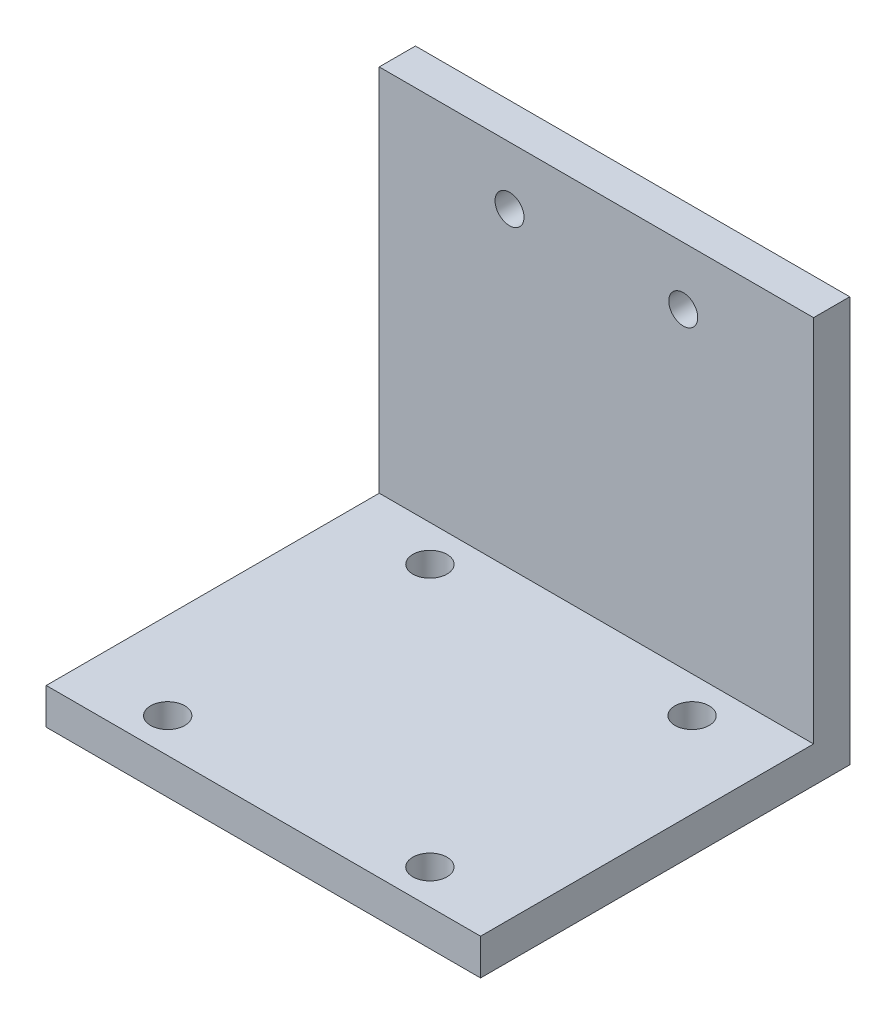
ISO-10303-21;
HEADER;
FILE_DESCRIPTION(('STEP AP214'),'2;1');
FILE_NAME('part.step','',(''),(''),'','','');
FILE_SCHEMA(('AUTOMOTIVE_DESIGN { 1 0 10303 214 1 1 1 1 }'));
ENDSEC;
DATA;
#1=APPLICATION_CONTEXT('core data for automotive mechanical design processes');
#2=APPLICATION_PROTOCOL_DEFINITION('international standard','automotive_design',2000,#1);
#3=PRODUCT_CONTEXT('',#1,'mechanical');
#4=PRODUCT('Part','Part','',(#3));
#5=PRODUCT_RELATED_PRODUCT_CATEGORY('part','',(#4));
#6=PRODUCT_DEFINITION_FORMATION('','',#4);
#7=PRODUCT_DEFINITION_CONTEXT('part definition',#1,'design');
#8=PRODUCT_DEFINITION('design','',#6,#7);
#9=PRODUCT_DEFINITION_SHAPE('','',#8);
#10=(LENGTH_UNIT() NAMED_UNIT(*) SI_UNIT(.MILLI.,.METRE.));
#11=(NAMED_UNIT(*) PLANE_ANGLE_UNIT() SI_UNIT($,.RADIAN.));
#12=(NAMED_UNIT(*) SI_UNIT($,.STERADIAN.) SOLID_ANGLE_UNIT());
#13=UNCERTAINTY_MEASURE_WITH_UNIT(LENGTH_MEASURE(1.E-05),#10,'distance_accuracy_value','');
#14=(GEOMETRIC_REPRESENTATION_CONTEXT(3) GLOBAL_UNCERTAINTY_ASSIGNED_CONTEXT((#13)) GLOBAL_UNIT_ASSIGNED_CONTEXT((#10,
#11,#12)) REPRESENTATION_CONTEXT('',''));
#15=CARTESIAN_POINT('',(0.,0.,0.));
#16=DIRECTION('',(0.,0.,1.));
#17=DIRECTION('',(1.,0.,0.));
#18=AXIS2_PLACEMENT_3D('',#15,#16,#17);
#19=CARTESIAN_POINT('',(-10.5885856079405,11.4520595533499,-3.175));
#20=DIRECTION('',(-1.,0.,0.));
#21=DIRECTION('',(0.,-1.,0.));
#22=AXIS2_PLACEMENT_3D('',#19,#20,#21);
#23=PLANE('',#22);
#24=DIRECTION('',(0.,-1.,0.));
#25=VECTOR('',#24,1.);
#26=CARTESIAN_POINT('',(-10.5885856079405,11.4520595533499,0.));
#27=LINE('',#26,#25);
#28=CARTESIAN_POINT('',(-10.5885856079405,11.4520595533499,0.));
#29=VERTEX_POINT('',#28);
#30=CARTESIAN_POINT('',(-10.5885856079405,-20.9329404466501,0.));
#31=VERTEX_POINT('',#30);
#32=EDGE_CURVE('E74',#29,#31,#27,.T.);
#33=ORIENTED_EDGE('',*,*,#32,.F.);
#34=DIRECTION('',(0.,0.,1.));
#35=VECTOR('',#34,1.);
#36=CARTESIAN_POINT('',(-10.5885856079405,11.4520595533499,-3.175));
#37=LINE('',#36,#35);
#38=CARTESIAN_POINT('',(-10.5885856079405,11.4520595533499,-3.175));
#39=VERTEX_POINT('',#38);
#40=EDGE_CURVE('E11',#39,#29,#37,.T.);
#41=ORIENTED_EDGE('',*,*,#40,.F.);
#42=DIRECTION('',(0.,-1.,0.));
#43=VECTOR('',#42,1.);
#44=CARTESIAN_POINT('',(-10.5885856079405,11.4520595533499,-3.175));
#45=LINE('',#44,#43);
#46=CARTESIAN_POINT('',(-10.5885856079404,-24.1079404466501,-3.175));
#47=VERTEX_POINT('',#46);
#48=EDGE_CURVE('E85',#39,#47,#45,.T.);
#49=ORIENTED_EDGE('',*,*,#48,.T.);
#50=DIRECTION('',(0.,0.,-1.));
#51=VECTOR('',#50,1.);
#52=CARTESIAN_POINT('',(-10.5885856079404,-24.1079404466501,0.));
#53=LINE('',#52,#51);
#54=CARTESIAN_POINT('',(-10.5885856079405,-24.1079404466501,29.21));
#55=VERTEX_POINT('',#54);
#56=EDGE_CURVE('E109',#55,#47,#53,.T.);
#57=ORIENTED_EDGE('',*,*,#56,.F.);
#58=DIRECTION('',(0.,-1.,0.));
#59=VECTOR('',#58,1.);
#60=CARTESIAN_POINT('',(-10.5885856079405,-24.1079404466501,29.21));
#61=LINE('',#60,#59);
#62=CARTESIAN_POINT('',(-10.5885856079405,-20.9329404466501,29.21));
#63=VERTEX_POINT('',#62);
#64=EDGE_CURVE('E125',#63,#55,#61,.T.);
#65=ORIENTED_EDGE('',*,*,#64,.F.);
#66=DIRECTION('',(0.,0.,-1.));
#67=VECTOR('',#66,1.);
#68=CARTESIAN_POINT('',(-10.5885856079405,-20.9329404466501,29.21));
#69=LINE('',#68,#67);
#70=EDGE_CURVE('E78',#63,#31,#69,.T.);
#71=ORIENTED_EDGE('',*,*,#70,.T.);
#72=EDGE_LOOP('',(#33,#41,#49,#57,#65,#71));
#73=FACE_BOUND('',#72,.T.);
#74=ADVANCED_FACE('F33',(#73),#23,.T.);
#75=CARTESIAN_POINT('',(-10.5885856079405,11.4520595533499,-3.175));
#76=DIRECTION('',(0.,1.,0.));
#77=DIRECTION('',(0.,0.,1.));
#78=AXIS2_PLACEMENT_3D('',#75,#76,#77);
#79=PLANE('',#78);
#80=DIRECTION('',(-1.,0.,0.));
#81=VECTOR('',#80,1.);
#82=CARTESIAN_POINT('',(-10.5885856079405,11.4520595533499,0.));
#83=LINE('',#82,#81);
#84=CARTESIAN_POINT('',(27.5114143920595,11.4520595533499,0.));
#85=VERTEX_POINT('',#84);
#86=EDGE_CURVE('E70',#85,#29,#83,.T.);
#87=ORIENTED_EDGE('',*,*,#86,.F.);
#88=DIRECTION('',(0.,0.,1.));
#89=VECTOR('',#88,1.);
#90=CARTESIAN_POINT('',(27.5114143920595,11.4520595533499,-3.175));
#91=LINE('',#90,#89);
#92=CARTESIAN_POINT('',(27.5114143920595,11.4520595533499,-3.175));
#93=VERTEX_POINT('',#92);
#94=EDGE_CURVE('E41',#93,#85,#91,.T.);
#95=ORIENTED_EDGE('',*,*,#94,.F.);
#96=DIRECTION('',(-1.,0.,0.));
#97=VECTOR('',#96,1.);
#98=CARTESIAN_POINT('',(-10.5885856079405,11.4520595533499,-3.175));
#99=LINE('',#98,#97);
#100=EDGE_CURVE('E72',#93,#39,#99,.T.);
#101=ORIENTED_EDGE('',*,*,#100,.T.);
#102=ORIENTED_EDGE('',*,*,#40,.T.);
#103=EDGE_LOOP('',(#87,#95,#101,#102));
#104=FACE_BOUND('',#103,.T.);
#105=ADVANCED_FACE('F68',(#104),#79,.T.);
#106=CARTESIAN_POINT('',(27.5114143920595,11.4520595533499,-3.175));
#107=DIRECTION('',(1.,0.,0.));
#108=DIRECTION('',(0.,0.,-1.));
#109=AXIS2_PLACEMENT_3D('',#106,#107,#108);
#110=PLANE('',#109);
#111=DIRECTION('',(0.,1.,0.));
#112=VECTOR('',#111,1.);
#113=CARTESIAN_POINT('',(27.5114143920595,11.4520595533499,0.));
#114=LINE('',#113,#112);
#115=CARTESIAN_POINT('',(27.5114143920595,-20.9329404466501,0.));
#116=VERTEX_POINT('',#115);
#117=EDGE_CURVE('E79',#116,#85,#114,.T.);
#118=ORIENTED_EDGE('',*,*,#117,.F.);
#119=DIRECTION('',(0.,0.,-1.));
#120=VECTOR('',#119,1.);
#121=CARTESIAN_POINT('',(27.5114143920595,-20.9329404466501,29.21));
#122=LINE('',#121,#120);
#123=CARTESIAN_POINT('',(27.5114143920595,-20.9329404466501,29.21));
#124=VERTEX_POINT('',#123);
#125=EDGE_CURVE('E115',#124,#116,#122,.T.);
#126=ORIENTED_EDGE('',*,*,#125,.F.);
#127=DIRECTION('',(0.,1.,0.));
#128=VECTOR('',#127,1.);
#129=CARTESIAN_POINT('',(27.5114143920595,-24.1079404466501,29.21));
#130=LINE('',#129,#128);
#131=CARTESIAN_POINT('',(27.5114143920595,-24.1079404466501,29.21));
#132=VERTEX_POINT('',#131);
#133=EDGE_CURVE('E121',#132,#124,#130,.T.);
#134=ORIENTED_EDGE('',*,*,#133,.F.);
#135=DIRECTION('',(0.,0.,1.));
#136=VECTOR('',#135,1.);
#137=CARTESIAN_POINT('',(27.5114143920595,-24.1079404466501,0.));
#138=LINE('',#137,#136);
#139=CARTESIAN_POINT('',(27.5114143920595,-24.1079404466501,-3.17499999999999));
#140=VERTEX_POINT('',#139);
#141=EDGE_CURVE('E112',#140,#132,#138,.T.);
#142=ORIENTED_EDGE('',*,*,#141,.F.);
#143=DIRECTION('',(0.,1.,0.));
#144=VECTOR('',#143,1.);
#145=CARTESIAN_POINT('',(27.5114143920595,11.4520595533499,-3.175));
#146=LINE('',#145,#144);
#147=EDGE_CURVE('E87',#140,#93,#146,.T.);
#148=ORIENTED_EDGE('',*,*,#147,.T.);
#149=ORIENTED_EDGE('',*,*,#94,.T.);
#150=EDGE_LOOP('',(#118,#126,#134,#142,#148,#149));
#151=FACE_BOUND('',#150,.T.);
#152=ADVANCED_FACE('F174',(#151),#110,.T.);
#153=CARTESIAN_POINT('',(0.,0.,-3.175));
#154=DIRECTION('',(0.,0.,1.));
#155=DIRECTION('',(1.,0.,0.));
#156=AXIS2_PLACEMENT_3D('',#153,#154,#155);
#157=PLANE('',#156);
#158=CARTESIAN_POINT('',(0.841414392059647,6.37205955334988,-3.175));
#159=DIRECTION('',(0.,0.,1.));
#160=DIRECTION('',(1.,0.,0.));
#161=AXIS2_PLACEMENT_3D('',#158,#159,#160);
#162=CIRCLE('',#161,1.27000000000004);
#163=CARTESIAN_POINT('',(2.11141439205969,6.37205955334988,-3.175));
#164=VERTEX_POINT('',#163);
#165=EDGE_CURVE('E98',#164,#164,#162,.T.);
#166=ORIENTED_EDGE('',*,*,#165,.T.);
#167=EDGE_LOOP('',(#166));
#168=FACE_BOUND('',#167,.T.);
#169=CARTESIAN_POINT('',(16.0814143920596,6.37205955334988,-3.175));
#170=DIRECTION('',(0.,0.,1.));
#171=DIRECTION('',(1.,0.,0.));
#172=AXIS2_PLACEMENT_3D('',#169,#170,#171);
#173=CIRCLE('',#172,1.27000000000004);
#174=CARTESIAN_POINT('',(17.3514143920596,6.37205955334988,-3.175));
#175=VERTEX_POINT('',#174);
#176=EDGE_CURVE('E80',#175,#175,#173,.T.);
#177=ORIENTED_EDGE('',*,*,#176,.T.);
#178=EDGE_LOOP('',(#177));
#179=FACE_BOUND('',#178,.T.);
#180=ORIENTED_EDGE('',*,*,#48,.F.);
#181=ORIENTED_EDGE('',*,*,#100,.F.);
#182=ORIENTED_EDGE('',*,*,#147,.F.);
#183=DIRECTION('',(1.,0.,0.));
#184=VECTOR('',#183,1.);
#185=CARTESIAN_POINT('',(27.5114143920595,-24.1079404466501,-3.17499999999999));
#186=LINE('',#185,#184);
#187=EDGE_CURVE('E104',#47,#140,#186,.T.);
#188=ORIENTED_EDGE('',*,*,#187,.F.);
#189=EDGE_LOOP('',(#180,#181,#182,#188));
#190=FACE_BOUND('',#189,.T.);
#191=ADVANCED_FACE('F179',(#168,#179,#190),#157,.F.);
#192=CARTESIAN_POINT('',(0.,0.,0.));
#193=DIRECTION('',(0.,0.,1.));
#194=DIRECTION('',(1.,0.,0.));
#195=AXIS2_PLACEMENT_3D('',#192,#193,#194);
#196=PLANE('',#195);
#197=DIRECTION('',(-1.,0.,0.));
#198=VECTOR('',#197,1.);
#199=CARTESIAN_POINT('',(27.5114143920595,-20.9329404466501,0.));
#200=LINE('',#199,#198);
#201=EDGE_CURVE('E49',#116,#31,#200,.T.);
#202=ORIENTED_EDGE('',*,*,#201,.F.);
#203=ORIENTED_EDGE('',*,*,#117,.T.);
#204=ORIENTED_EDGE('',*,*,#86,.T.);
#205=ORIENTED_EDGE('',*,*,#32,.T.);
#206=EDGE_LOOP('',(#202,#203,#204,#205));
#207=FACE_BOUND('',#206,.T.);
#208=CARTESIAN_POINT('',(0.841414392059647,6.37205955334988,0.));
#209=DIRECTION('',(0.,0.,1.));
#210=DIRECTION('',(1.,0.,0.));
#211=AXIS2_PLACEMENT_3D('',#208,#209,#210);
#212=CIRCLE('',#211,1.27000000000004);
#213=CARTESIAN_POINT('',(2.11141439205969,6.37205955334988,0.));
#214=VERTEX_POINT('',#213);
#215=EDGE_CURVE('E101',#214,#214,#212,.T.);
#216=ORIENTED_EDGE('',*,*,#215,.F.);
#217=EDGE_LOOP('',(#216));
#218=FACE_BOUND('',#217,.T.);
#219=CARTESIAN_POINT('',(16.0814143920596,6.37205955334988,0.));
#220=DIRECTION('',(0.,0.,1.));
#221=DIRECTION('',(1.,0.,0.));
#222=AXIS2_PLACEMENT_3D('',#219,#220,#221);
#223=CIRCLE('',#222,1.27000000000004);
#224=CARTESIAN_POINT('',(17.3514143920596,6.37205955334988,0.));
#225=VERTEX_POINT('',#224);
#226=EDGE_CURVE('E95',#225,#225,#223,.T.);
#227=ORIENTED_EDGE('',*,*,#226,.F.);
#228=EDGE_LOOP('',(#227));
#229=FACE_BOUND('',#228,.T.);
#230=ADVANCED_FACE('F82',(#207,#218,#229),#196,.T.);
#231=CARTESIAN_POINT('',(16.0814143920596,6.37205955334988,-3.175));
#232=DIRECTION('',(0.,0.,1.));
#233=DIRECTION('',(1.,0.,0.));
#234=AXIS2_PLACEMENT_3D('',#231,#232,#233);
#235=CYLINDRICAL_SURFACE('',#234,1.27000000000004);
#236=ORIENTED_EDGE('',*,*,#176,.F.);
#237=EDGE_LOOP('',(#236));
#238=FACE_BOUND('',#237,.T.);
#239=ORIENTED_EDGE('',*,*,#226,.T.);
#240=EDGE_LOOP('',(#239));
#241=FACE_BOUND('',#240,.T.);
#242=ADVANCED_FACE('F183',(#238,#241),#235,.F.);
#243=CARTESIAN_POINT('',(0.841414392059647,6.37205955334988,-3.175));
#244=DIRECTION('',(0.,0.,1.));
#245=DIRECTION('',(1.,0.,0.));
#246=AXIS2_PLACEMENT_3D('',#243,#244,#245);
#247=CYLINDRICAL_SURFACE('',#246,1.27000000000004);
#248=ORIENTED_EDGE('',*,*,#165,.F.);
#249=EDGE_LOOP('',(#248));
#250=FACE_BOUND('',#249,.T.);
#251=ORIENTED_EDGE('',*,*,#215,.T.);
#252=EDGE_LOOP('',(#251));
#253=FACE_BOUND('',#252,.T.);
#254=ADVANCED_FACE('F189',(#250,#253),#247,.F.);
#255=CARTESIAN_POINT('',(0.,-24.1079404466501,0.));
#256=DIRECTION('',(0.,1.,0.));
#257=DIRECTION('',(0.,0.,1.));
#258=AXIS2_PLACEMENT_3D('',#255,#256,#257);
#259=PLANE('',#258);
#260=CARTESIAN_POINT('',(-2.96858560794045,-24.1079404466501,3.175));
#261=DIRECTION('',(0.,-1.,0.));
#262=DIRECTION('',(0.,0.,-1.));
#263=AXIS2_PLACEMENT_3D('',#260,#261,#262);
#264=CIRCLE('',#263,1.50000004799999);
#265=CARTESIAN_POINT('',(-2.96858560794045,-24.1079404466501,1.67499995200001));
#266=VERTEX_POINT('',#265);
#267=EDGE_CURVE('E150',#266,#266,#264,.T.);
#268=ORIENTED_EDGE('',*,*,#267,.F.);
#269=EDGE_LOOP('',(#268));
#270=FACE_BOUND('',#269,.T.);
#271=CARTESIAN_POINT('',(20.0314143920596,-24.1079404466501,3.175));
#272=DIRECTION('',(0.,-1.,0.));
#273=DIRECTION('',(0.,0.,-1.));
#274=AXIS2_PLACEMENT_3D('',#271,#272,#273);
#275=CIRCLE('',#274,1.50000004799999);
#276=CARTESIAN_POINT('',(20.0314143920596,-24.1079404466501,1.67499995200001));
#277=VERTEX_POINT('',#276);
#278=EDGE_CURVE('E147',#277,#277,#275,.T.);
#279=ORIENTED_EDGE('',*,*,#278,.F.);
#280=EDGE_LOOP('',(#279));
#281=FACE_BOUND('',#280,.T.);
#282=CARTESIAN_POINT('',(20.0314143920595,-24.1079404466501,26.175));
#283=DIRECTION('',(0.,-1.,0.));
#284=DIRECTION('',(0.,0.,-1.));
#285=AXIS2_PLACEMENT_3D('',#282,#283,#284);
#286=CIRCLE('',#285,1.50000004799999);
#287=CARTESIAN_POINT('',(20.0314143920595,-24.1079404466501,24.674999952));
#288=VERTEX_POINT('',#287);
#289=EDGE_CURVE('E141',#288,#288,#286,.T.);
#290=ORIENTED_EDGE('',*,*,#289,.F.);
#291=EDGE_LOOP('',(#290));
#292=FACE_BOUND('',#291,.T.);
#293=CARTESIAN_POINT('',(-2.96858560794045,-24.1079404466501,26.175));
#294=DIRECTION('',(0.,-1.,0.));
#295=DIRECTION('',(0.,0.,-1.));
#296=AXIS2_PLACEMENT_3D('',#293,#294,#295);
#297=CIRCLE('',#296,1.50000004799999);
#298=CARTESIAN_POINT('',(-2.96858560794045,-24.1079404466501,24.674999952));
#299=VERTEX_POINT('',#298);
#300=EDGE_CURVE('E135',#299,#299,#297,.T.);
#301=ORIENTED_EDGE('',*,*,#300,.F.);
#302=EDGE_LOOP('',(#301));
#303=FACE_BOUND('',#302,.T.);
#304=ORIENTED_EDGE('',*,*,#141,.T.);
#305=DIRECTION('',(1.,0.,0.));
#306=VECTOR('',#305,1.);
#307=CARTESIAN_POINT('',(27.5114143920595,-24.1079404466501,29.21));
#308=LINE('',#307,#306);
#309=EDGE_CURVE('E119',#55,#132,#308,.T.);
#310=ORIENTED_EDGE('',*,*,#309,.F.);
#311=ORIENTED_EDGE('',*,*,#56,.T.);
#312=ORIENTED_EDGE('',*,*,#187,.T.);
#313=EDGE_LOOP('',(#304,#310,#311,#312));
#314=FACE_BOUND('',#313,.T.);
#315=ADVANCED_FACE('F193',(#270,#281,#292,#303,#314),#259,.F.);
#316=CARTESIAN_POINT('',(27.5114143920595,-20.9329404466501,29.21));
#317=DIRECTION('',(0.,-1.,0.));
#318=DIRECTION('',(1.,0.,0.));
#319=AXIS2_PLACEMENT_3D('',#316,#317,#318);
#320=PLANE('',#319);
#321=CARTESIAN_POINT('',(-2.96858560794045,-20.9329404466501,3.175));
#322=DIRECTION('',(0.,-1.,0.));
#323=DIRECTION('',(1.,0.,0.));
#324=AXIS2_PLACEMENT_3D('',#321,#322,#323);
#325=CIRCLE('',#324,1.50000004799999);
#326=CARTESIAN_POINT('',(-1.46858555994046,-20.9329404466501,3.175));
#327=VERTEX_POINT('',#326);
#328=EDGE_CURVE('E36',#327,#327,#325,.T.);
#329=ORIENTED_EDGE('',*,*,#328,.T.);
#330=EDGE_LOOP('',(#329));
#331=FACE_BOUND('',#330,.T.);
#332=CARTESIAN_POINT('',(20.0314143920596,-20.9329404466501,3.175));
#333=DIRECTION('',(0.,-1.,0.));
#334=DIRECTION('',(1.,0.,0.));
#335=AXIS2_PLACEMENT_3D('',#332,#333,#334);
#336=CIRCLE('',#335,1.50000004799999);
#337=CARTESIAN_POINT('',(21.5314144400595,-20.9329404466501,3.175));
#338=VERTEX_POINT('',#337);
#339=EDGE_CURVE('E144',#338,#338,#336,.T.);
#340=ORIENTED_EDGE('',*,*,#339,.T.);
#341=EDGE_LOOP('',(#340));
#342=FACE_BOUND('',#341,.T.);
#343=CARTESIAN_POINT('',(20.0314143920595,-20.9329404466501,26.175));
#344=DIRECTION('',(0.,-1.,0.));
#345=DIRECTION('',(1.,0.,0.));
#346=AXIS2_PLACEMENT_3D('',#343,#344,#345);
#347=CIRCLE('',#346,1.50000004799999);
#348=CARTESIAN_POINT('',(21.5314144400595,-20.9329404466501,26.175));
#349=VERTEX_POINT('',#348);
#350=EDGE_CURVE('E138',#349,#349,#347,.T.);
#351=ORIENTED_EDGE('',*,*,#350,.T.);
#352=EDGE_LOOP('',(#351));
#353=FACE_BOUND('',#352,.T.);
#354=CARTESIAN_POINT('',(-2.96858560794045,-20.9329404466501,26.175));
#355=DIRECTION('',(0.,-1.,0.));
#356=DIRECTION('',(1.,0.,0.));
#357=AXIS2_PLACEMENT_3D('',#354,#355,#356);
#358=CIRCLE('',#357,1.50000004799999);
#359=CARTESIAN_POINT('',(-1.46858555994047,-20.9329404466501,26.175));
#360=VERTEX_POINT('',#359);
#361=EDGE_CURVE('E122',#360,#360,#358,.T.);
#362=ORIENTED_EDGE('',*,*,#361,.T.);
#363=EDGE_LOOP('',(#362));
#364=FACE_BOUND('',#363,.T.);
#365=ORIENTED_EDGE('',*,*,#201,.T.);
#366=ORIENTED_EDGE('',*,*,#70,.F.);
#367=DIRECTION('',(-1.,0.,0.));
#368=VECTOR('',#367,1.);
#369=CARTESIAN_POINT('',(27.5114143920595,-20.9329404466501,29.21));
#370=LINE('',#369,#368);
#371=EDGE_CURVE('E128',#124,#63,#370,.T.);
#372=ORIENTED_EDGE('',*,*,#371,.F.);
#373=ORIENTED_EDGE('',*,*,#125,.T.);
#374=EDGE_LOOP('',(#365,#366,#372,#373));
#375=FACE_BOUND('',#374,.T.);
#376=ADVANCED_FACE('F157',(#331,#342,#353,#364,#375),#320,.F.);
#377=CARTESIAN_POINT('',(0.,0.,29.21));
#378=DIRECTION('',(0.,0.,1.));
#379=DIRECTION('',(1.,0.,0.));
#380=AXIS2_PLACEMENT_3D('',#377,#378,#379);
#381=PLANE('',#380);
#382=ORIENTED_EDGE('',*,*,#133,.T.);
#383=ORIENTED_EDGE('',*,*,#371,.T.);
#384=ORIENTED_EDGE('',*,*,#64,.T.);
#385=ORIENTED_EDGE('',*,*,#309,.T.);
#386=EDGE_LOOP('',(#382,#383,#384,#385));
#387=FACE_BOUND('',#386,.T.);
#388=ADVANCED_FACE('F200',(#387),#381,.T.);
#389=CARTESIAN_POINT('',(-2.96858560794045,-24.1079404466501,26.175));
#390=DIRECTION('',(0.,-1.,0.));
#391=DIRECTION('',(0.,0.,-1.));
#392=AXIS2_PLACEMENT_3D('',#389,#390,#391);
#393=CYLINDRICAL_SURFACE('',#392,1.50000004799999);
#394=ORIENTED_EDGE('',*,*,#300,.T.);
#395=EDGE_LOOP('',(#394));
#396=FACE_BOUND('',#395,.T.);
#397=ORIENTED_EDGE('',*,*,#361,.F.);
#398=EDGE_LOOP('',(#397));
#399=FACE_BOUND('',#398,.T.);
#400=ADVANCED_FACE('F203',(#396,#399),#393,.F.);
#401=CARTESIAN_POINT('',(20.0314143920595,-24.1079404466501,26.175));
#402=DIRECTION('',(0.,-1.,0.));
#403=DIRECTION('',(0.,0.,-1.));
#404=AXIS2_PLACEMENT_3D('',#401,#402,#403);
#405=CYLINDRICAL_SURFACE('',#404,1.50000004799999);
#406=ORIENTED_EDGE('',*,*,#289,.T.);
#407=EDGE_LOOP('',(#406));
#408=FACE_BOUND('',#407,.T.);
#409=ORIENTED_EDGE('',*,*,#350,.F.);
#410=EDGE_LOOP('',(#409));
#411=FACE_BOUND('',#410,.T.);
#412=ADVANCED_FACE('F167',(#408,#411),#405,.F.);
#413=CARTESIAN_POINT('',(20.0314143920596,-24.1079404466501,3.175));
#414=DIRECTION('',(0.,-1.,0.));
#415=DIRECTION('',(0.,0.,-1.));
#416=AXIS2_PLACEMENT_3D('',#413,#414,#415);
#417=CYLINDRICAL_SURFACE('',#416,1.50000004799999);
#418=ORIENTED_EDGE('',*,*,#278,.T.);
#419=EDGE_LOOP('',(#418));
#420=FACE_BOUND('',#419,.T.);
#421=ORIENTED_EDGE('',*,*,#339,.F.);
#422=EDGE_LOOP('',(#421));
#423=FACE_BOUND('',#422,.T.);
#424=ADVANCED_FACE('F162',(#420,#423),#417,.F.);
#425=CARTESIAN_POINT('',(-2.96858560794045,-24.1079404466501,3.175));
#426=DIRECTION('',(0.,-1.,0.));
#427=DIRECTION('',(0.,0.,-1.));
#428=AXIS2_PLACEMENT_3D('',#425,#426,#427);
#429=CYLINDRICAL_SURFACE('',#428,1.50000004799999);
#430=ORIENTED_EDGE('',*,*,#267,.T.);
#431=EDGE_LOOP('',(#430));
#432=FACE_BOUND('',#431,.T.);
#433=ORIENTED_EDGE('',*,*,#328,.F.);
#434=EDGE_LOOP('',(#433));
#435=FACE_BOUND('',#434,.T.);
#436=ADVANCED_FACE('F160',(#432,#435),#429,.F.);
#437=CLOSED_SHELL('',(#74,#105,#152,#191,#230,#242,#254,#315,#376,#388,#400,#412,#424,#436));
#438=MANIFOLD_SOLID_BREP('B2',#437);
#439=ADVANCED_BREP_SHAPE_REPRESENTATION('',(#18,#438),#14);
#440=SHAPE_DEFINITION_REPRESENTATION(#9,#439);
ENDSEC;
END-ISO-10303-21;
